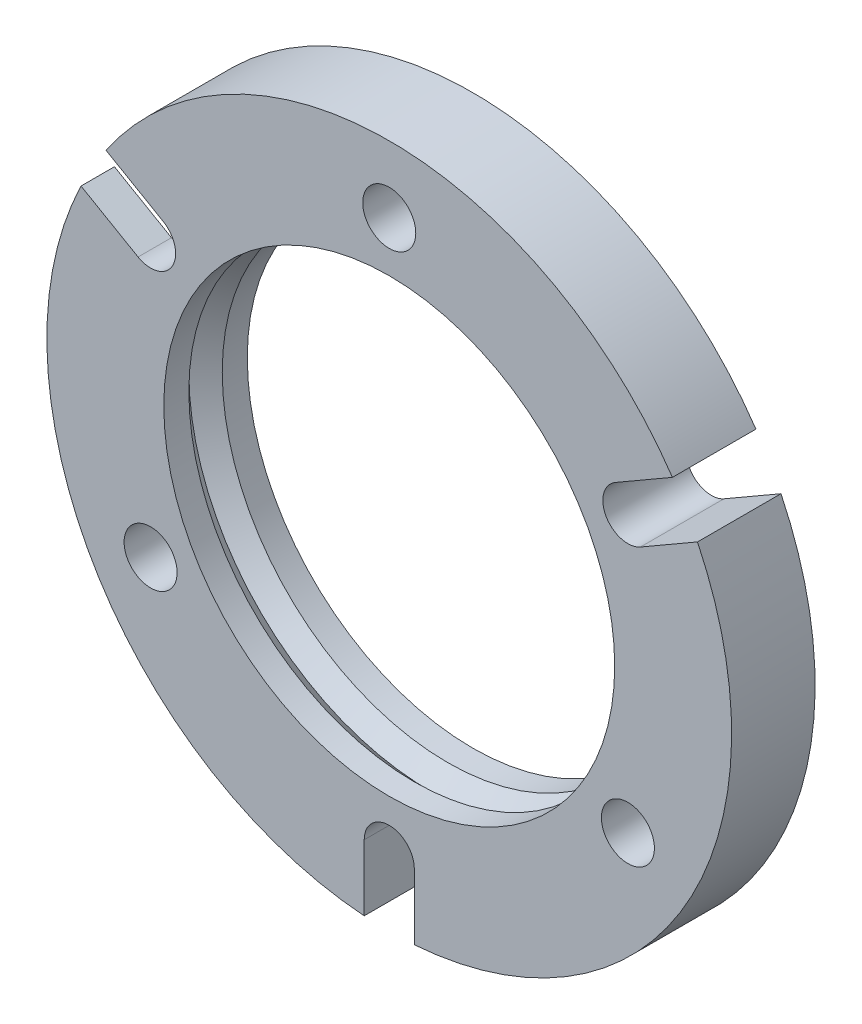
ISO-10303-21;
HEADER;
FILE_DESCRIPTION(('STEP AP214'),'2;1');
FILE_NAME('part.step','',(''),(''),'','','');
FILE_SCHEMA(('AUTOMOTIVE_DESIGN { 1 0 10303 214 1 1 1 1 }'));
ENDSEC;
DATA;
#1=APPLICATION_CONTEXT('core data for automotive mechanical design processes');
#2=APPLICATION_PROTOCOL_DEFINITION('international standard','automotive_design',2000,#1);
#3=PRODUCT_CONTEXT('',#1,'mechanical');
#4=PRODUCT('Part','Part','',(#3));
#5=PRODUCT_RELATED_PRODUCT_CATEGORY('part','',(#4));
#6=PRODUCT_DEFINITION_FORMATION('','',#4);
#7=PRODUCT_DEFINITION_CONTEXT('part definition',#1,'design');
#8=PRODUCT_DEFINITION('design','',#6,#7);
#9=PRODUCT_DEFINITION_SHAPE('','',#8);
#10=(LENGTH_UNIT() NAMED_UNIT(*) SI_UNIT(.MILLI.,.METRE.));
#11=(NAMED_UNIT(*) PLANE_ANGLE_UNIT() SI_UNIT($,.RADIAN.));
#12=(NAMED_UNIT(*) SI_UNIT($,.STERADIAN.) SOLID_ANGLE_UNIT());
#13=UNCERTAINTY_MEASURE_WITH_UNIT(LENGTH_MEASURE(1.E-05),#10,'distance_accuracy_value','');
#14=(GEOMETRIC_REPRESENTATION_CONTEXT(3) GLOBAL_UNCERTAINTY_ASSIGNED_CONTEXT((#13)) GLOBAL_UNIT_ASSIGNED_CONTEXT((#10,
#11,#12)) REPRESENTATION_CONTEXT('',''));
#15=CARTESIAN_POINT('',(0.,0.,0.));
#16=DIRECTION('',(0.,0.,1.));
#17=DIRECTION('',(1.,0.,0.));
#18=AXIS2_PLACEMENT_3D('',#15,#16,#17);
#19=CARTESIAN_POINT('',(0.,0.,0.));
#20=DIRECTION('',(0.,0.,1.));
#21=DIRECTION('',(1.,0.,0.));
#22=AXIS2_PLACEMENT_3D('',#19,#20,#21);
#23=PLANE('',#22);
#24=CARTESIAN_POINT('',(14.2894191624432,-8.25,0.));
#25=DIRECTION('',(0.,0.,1.));
#26=DIRECTION('',(1.,0.,0.));
#27=AXIS2_PLACEMENT_3D('',#24,#25,#26);
#28=CIRCLE('',#27,1.5875);
#29=CARTESIAN_POINT('',(15.8769191624432,-8.25,0.));
#30=VERTEX_POINT('',#29);
#31=EDGE_CURVE('E282',#30,#30,#28,.T.);
#32=ORIENTED_EDGE('',*,*,#31,.T.);
#33=EDGE_LOOP('',(#32));
#34=FACE_BOUND('',#33,.T.);
#35=CARTESIAN_POINT('',(0.,0.,0.));
#36=DIRECTION('',(0.,0.,1.));
#37=DIRECTION('',(1.,0.,0.));
#38=AXIS2_PLACEMENT_3D('',#35,#36,#37);
#39=CIRCLE('',#38,13.5);
#40=CARTESIAN_POINT('',(13.5,0.,0.));
#41=VERTEX_POINT('',#40);
#42=EDGE_CURVE('E294',#41,#41,#39,.T.);
#43=ORIENTED_EDGE('',*,*,#42,.T.);
#44=EDGE_LOOP('',(#43));
#45=FACE_BOUND('',#44,.T.);
#46=CARTESIAN_POINT('',(0.,16.5,0.));
#47=DIRECTION('',(0.,0.,1.));
#48=DIRECTION('',(1.,0.,0.));
#49=AXIS2_PLACEMENT_3D('',#46,#47,#48);
#50=CIRCLE('',#49,1.5875);
#51=CARTESIAN_POINT('',(1.5875,16.5,0.));
#52=VERTEX_POINT('',#51);
#53=EDGE_CURVE('E288',#52,#52,#50,.T.);
#54=ORIENTED_EDGE('',*,*,#53,.T.);
#55=EDGE_LOOP('',(#54));
#56=FACE_BOUND('',#55,.T.);
#57=CARTESIAN_POINT('',(-14.2894191624432,-8.25,0.));
#58=DIRECTION('',(0.,0.,1.));
#59=DIRECTION('',(1.,0.,0.));
#60=AXIS2_PLACEMENT_3D('',#57,#58,#59);
#61=CIRCLE('',#60,1.5875);
#62=CARTESIAN_POINT('',(-12.7019191624432,-8.25,0.));
#63=VERTEX_POINT('',#62);
#64=EDGE_CURVE('E272',#63,#63,#61,.T.);
#65=ORIENTED_EDGE('',*,*,#64,.T.);
#66=EDGE_LOOP('',(#65));
#67=FACE_BOUND('',#66,.T.);
#68=DIRECTION('',(0.382683432365094,0.923879532511285,0.));
#69=VECTOR('',#68,1.);
#70=CARTESIAN_POINT('',(-20.3390922963216,-10.2748918223623,0.));
#71=LINE('',#70,#69);
#72=CARTESIAN_POINT('',(-14.5519568350027,3.69648909564402,0.));
#73=VERTEX_POINT('',#72);
#74=CARTESIAN_POINT('',(-12.9035998636763,7.67597485145243,0.));
#75=VERTEX_POINT('',#74);
#76=EDGE_CURVE('E162',#73,#75,#71,.T.);
#77=ORIENTED_EDGE('',*,*,#76,.T.);
#78=CARTESIAN_POINT('',(-14.2894191624432,8.25000000000007,0.));
#79=DIRECTION('',(0.,0.,1.));
#80=DIRECTION('',(-0.500000000000004,-0.866025403784436,0.));
#81=AXIS2_PLACEMENT_3D('',#78,#79,#80);
#82=CIRCLE('',#81,1.5);
#83=CARTESIAN_POINT('',(-13.5394191624432,9.54903810567672,0.));
#84=VERTEX_POINT('',#83);
#85=EDGE_CURVE('E221',#75,#84,#82,.T.);
#86=ORIENTED_EDGE('',*,*,#85,.T.);
#87=DIRECTION('',(-0.866025403784436,0.500000000000004,0.));
#88=VECTOR('',#87,1.);
#89=CARTESIAN_POINT('',(-38.4302201978172,23.9197487837955,0.));
#90=LINE('',#89,#88);
#91=CARTESIAN_POINT('',(-16.9559312096257,11.5215622558072,0.));
#92=VERTEX_POINT('',#91);
#93=EDGE_CURVE('E223',#84,#92,#90,.T.);
#94=ORIENTED_EDGE('',*,*,#93,.T.);
#95=CARTESIAN_POINT('',(0.,0.,0.));
#96=DIRECTION('',(0.,0.,1.));
#97=DIRECTION('',(1.,0.,0.));
#98=AXIS2_PLACEMENT_3D('',#95,#96,#97);
#99=CIRCLE('',#98,20.5);
#100=CARTESIAN_POINT('',(16.9559312096259,11.5215622558069,0.));
#101=VERTEX_POINT('',#100);
#102=EDGE_CURVE('E386',#101,#92,#99,.T.);
#103=ORIENTED_EDGE('',*,*,#102,.F.);
#104=DIRECTION('',(0.866025403784443,0.499999999999992,0.));
#105=VECTOR('',#104,1.);
#106=CARTESIAN_POINT('',(38.4302201978176,23.919748783795,0.));
#107=LINE('',#106,#105);
#108=CARTESIAN_POINT('',(13.5394191624433,9.54903810567653,0.));
#109=VERTEX_POINT('',#108);
#110=EDGE_CURVE('E198',#109,#101,#107,.T.);
#111=ORIENTED_EDGE('',*,*,#110,.F.);
#112=CARTESIAN_POINT('',(14.2894191624433,8.24999999999987,0.));
#113=DIRECTION('',(0.,0.,1.));
#114=DIRECTION('',(-0.499999999999992,0.866025403784443,0.));
#115=AXIS2_PLACEMENT_3D('',#112,#113,#114);
#116=CIRCLE('',#115,1.5);
#117=CARTESIAN_POINT('',(15.0394191624433,6.9509618943232,0.));
#118=VERTEX_POINT('',#117);
#119=EDGE_CURVE('E200',#109,#118,#116,.T.);
#120=ORIENTED_EDGE('',*,*,#119,.T.);
#121=DIRECTION('',(0.866025403784443,0.499999999999992,0.));
#122=VECTOR('',#121,1.);
#123=CARTESIAN_POINT('',(39.9302201978175,21.3216725724416,0.));
#124=LINE('',#123,#122);
#125=CARTESIAN_POINT('',(18.4559312096259,8.92348604445361,0.));
#126=VERTEX_POINT('',#125);
#127=EDGE_CURVE('E203',#118,#126,#124,.T.);
#128=ORIENTED_EDGE('',*,*,#127,.T.);
#129=CARTESIAN_POINT('',(1.5,-20.4450483002609,0.));
#130=VERTEX_POINT('',#129);
#131=EDGE_CURVE('E46',#130,#126,#99,.T.);
#132=ORIENTED_EDGE('',*,*,#131,.F.);
#133=DIRECTION('',(0.,-1.,0.));
#134=VECTOR('',#133,1.);
#135=CARTESIAN_POINT('',(1.5,-45.2414213562373,0.));
#136=LINE('',#135,#134);
#137=CARTESIAN_POINT('',(1.5,-16.5,0.));
#138=VERTEX_POINT('',#137);
#139=EDGE_CURVE('E253',#138,#130,#136,.T.);
#140=ORIENTED_EDGE('',*,*,#139,.F.);
#141=CARTESIAN_POINT('',(0.,-16.5,0.));
#142=DIRECTION('',(0.,0.,1.));
#143=DIRECTION('',(1.,0.,0.));
#144=AXIS2_PLACEMENT_3D('',#141,#142,#143);
#145=CIRCLE('',#144,1.5);
#146=CARTESIAN_POINT('',(-1.5,-16.5,0.));
#147=VERTEX_POINT('',#146);
#148=EDGE_CURVE('E255',#138,#147,#145,.T.);
#149=ORIENTED_EDGE('',*,*,#148,.T.);
#150=DIRECTION('',(0.,-1.,0.));
#151=VECTOR('',#150,1.);
#152=CARTESIAN_POINT('',(-1.5,-45.2414213562373,0.));
#153=LINE('',#152,#151);
#154=CARTESIAN_POINT('',(-1.5,-20.4450483002609,0.));
#155=VERTEX_POINT('',#154);
#156=EDGE_CURVE('E259',#147,#155,#153,.T.);
#157=ORIENTED_EDGE('',*,*,#156,.T.);
#158=CARTESIAN_POINT('',(-20.1697652153486,3.66477436654886,0.));
#159=VERTEX_POINT('',#158);
#160=EDGE_CURVE('E300',#159,#155,#99,.T.);
#161=ORIENTED_EDGE('',*,*,#160,.F.);
#162=DIRECTION('',(-0.976691955125332,0.214645812429352,0.));
#163=VECTOR('',#162,1.);
#164=CARTESIAN_POINT('',(-43.2949444622215,8.74695289886047,0.));
#165=LINE('',#164,#163);
#166=CARTESIAN_POINT('',(-16.2597448524136,2.80547631150366,0.));
#167=VERTEX_POINT('',#166);
#168=EDGE_CURVE('E175',#167,#159,#165,.T.);
#169=ORIENTED_EDGE('',*,*,#168,.F.);
#170=CARTESIAN_POINT('',(-15.9377761337696,4.27051424419166,0.));
#171=DIRECTION('',(0.,0.,-1.));
#172=DIRECTION('',(-1.,0.,0.));
#173=AXIS2_PLACEMENT_3D('',#170,#171,#172);
#174=CIRCLE('',#173,1.5);
#175=EDGE_CURVE('E188',#73,#167,#174,.T.);
#176=ORIENTED_EDGE('',*,*,#175,.F.);
#177=EDGE_LOOP('',(#77,#86,#94,#103,#111,#120,#128,#132,#140,#149,#157,#161,#169,#176));
#178=FACE_BOUND('',#177,.T.);
#179=ADVANCED_FACE('F42',(#34,#45,#56,#67,#178),#23,.F.);
#180=CARTESIAN_POINT('',(-39.9302201978172,21.3216725724422,0.));
#181=DIRECTION('',(0.500000000000004,0.866025403784436,0.));
#182=DIRECTION('',(-0.866025403784436,0.500000000000004,0.));
#183=AXIS2_PLACEMENT_3D('',#180,#181,#182);
#184=PLANE('',#183);
#185=DIRECTION('',(0.,0.,1.));
#186=VECTOR('',#185,1.);
#187=CARTESIAN_POINT('',(-15.0394191624432,6.95096189432341,0.));
#188=LINE('',#187,#186);
#189=CARTESIAN_POINT('',(-15.0394191624432,6.95096189432341,3.));
#190=VERTEX_POINT('',#189);
#191=CARTESIAN_POINT('',(-15.0394191624432,6.95096189432341,5.));
#192=VERTEX_POINT('',#191);
#193=EDGE_CURVE('E227',#190,#192,#188,.T.);
#194=ORIENTED_EDGE('',*,*,#193,.F.);
#195=DIRECTION('',(0.866025403784436,-0.500000000000004,0.));
#196=VECTOR('',#195,1.);
#197=CARTESIAN_POINT('',(-34.6703034333718,18.2848582125745,3.));
#198=LINE('',#197,#196);
#199=CARTESIAN_POINT('',(-18.4559312096257,8.92348604445386,3.));
#200=VERTEX_POINT('',#199);
#201=EDGE_CURVE('E59',#200,#190,#198,.T.);
#202=ORIENTED_EDGE('',*,*,#201,.F.);
#203=DIRECTION('',(0.,0.,1.));
#204=VECTOR('',#203,1.);
#205=CARTESIAN_POINT('',(-18.4559312096257,8.92348604445386,0.));
#206=LINE('',#205,#204);
#207=CARTESIAN_POINT('',(-18.4559312096257,8.92348604445386,5.));
#208=VERTEX_POINT('',#207);
#209=EDGE_CURVE('E235',#200,#208,#206,.T.);
#210=ORIENTED_EDGE('',*,*,#209,.T.);
#211=DIRECTION('',(-0.866025403784436,0.500000000000004,0.));
#212=VECTOR('',#211,1.);
#213=CARTESIAN_POINT('',(-39.9302201978172,21.3216725724422,5.));
#214=LINE('',#213,#212);
#215=EDGE_CURVE('E215',#192,#208,#214,.T.);
#216=ORIENTED_EDGE('',*,*,#215,.F.);
#217=EDGE_LOOP('',(#194,#202,#210,#216));
#218=FACE_BOUND('',#217,.T.);
#219=ADVANCED_FACE('F335',(#218),#184,.T.);
#220=CARTESIAN_POINT('',(-14.2894191624432,8.25000000000007,0.));
#221=DIRECTION('',(0.,0.,1.));
#222=DIRECTION('',(1.,0.,0.));
#223=AXIS2_PLACEMENT_3D('',#220,#221,#222);
#224=CYLINDRICAL_SURFACE('',#223,1.5);
#225=DIRECTION('',(0.,0.,-1.));
#226=VECTOR('',#225,1.);
#227=CARTESIAN_POINT('',(-12.9035998636763,7.67597485145243,3.));
#228=LINE('',#227,#226);
#229=CARTESIAN_POINT('',(-12.9035998636763,7.67597485145243,3.));
#230=VERTEX_POINT('',#229);
#231=EDGE_CURVE('E191',#230,#75,#228,.T.);
#232=ORIENTED_EDGE('',*,*,#231,.F.);
#233=CARTESIAN_POINT('',(-14.2894191624432,8.25000000000007,3.));
#234=DIRECTION('',(0.,0.,-1.));
#235=DIRECTION('',(-1.,0.,0.));
#236=AXIS2_PLACEMENT_3D('',#233,#234,#235);
#237=CIRCLE('',#236,1.5);
#238=EDGE_CURVE('E168',#190,#230,#237,.F.);
#239=ORIENTED_EDGE('',*,*,#238,.F.);
#240=ORIENTED_EDGE('',*,*,#193,.T.);
#241=CARTESIAN_POINT('',(-14.2894191624432,8.25000000000007,5.));
#242=DIRECTION('',(0.,0.,1.));
#243=DIRECTION('',(-0.500000000000004,-0.866025403784436,0.));
#244=AXIS2_PLACEMENT_3D('',#241,#242,#243);
#245=CIRCLE('',#244,1.5);
#246=CARTESIAN_POINT('',(-13.5394191624432,9.54903810567672,5.));
#247=VERTEX_POINT('',#246);
#248=EDGE_CURVE('E230',#192,#247,#245,.T.);
#249=ORIENTED_EDGE('',*,*,#248,.T.);
#250=DIRECTION('',(0.,0.,1.));
#251=VECTOR('',#250,1.);
#252=CARTESIAN_POINT('',(-13.5394191624432,9.54903810567672,0.));
#253=LINE('',#252,#251);
#254=EDGE_CURVE('E241',#84,#247,#253,.T.);
#255=ORIENTED_EDGE('',*,*,#254,.F.);
#256=ORIENTED_EDGE('',*,*,#85,.F.);
#257=EDGE_LOOP('',(#232,#239,#240,#249,#255,#256));
#258=FACE_BOUND('',#257,.T.);
#259=ADVANCED_FACE('F340',(#258),#224,.F.);
#260=CARTESIAN_POINT('',(0.,0.,5.));
#261=DIRECTION('',(0.,0.,1.));
#262=DIRECTION('',(1.,0.,0.));
#263=AXIS2_PLACEMENT_3D('',#260,#261,#262);
#264=PLANE('',#263);
#265=CARTESIAN_POINT('',(-14.2894191624432,-8.25,5.));
#266=DIRECTION('',(0.,0.,1.));
#267=DIRECTION('',(1.,0.,0.));
#268=AXIS2_PLACEMENT_3D('',#265,#266,#267);
#269=CIRCLE('',#268,1.5875);
#270=CARTESIAN_POINT('',(-12.7019191624432,-8.25,5.));
#271=VERTEX_POINT('',#270);
#272=EDGE_CURVE('E279',#271,#271,#269,.T.);
#273=ORIENTED_EDGE('',*,*,#272,.F.);
#274=EDGE_LOOP('',(#273));
#275=FACE_BOUND('',#274,.T.);
#276=CARTESIAN_POINT('',(0.,16.5,5.));
#277=DIRECTION('',(0.,0.,1.));
#278=DIRECTION('',(1.,0.,0.));
#279=AXIS2_PLACEMENT_3D('',#276,#277,#278);
#280=CIRCLE('',#279,1.5875);
#281=CARTESIAN_POINT('',(1.5875,16.5,5.));
#282=VERTEX_POINT('',#281);
#283=EDGE_CURVE('E291',#282,#282,#280,.T.);
#284=ORIENTED_EDGE('',*,*,#283,.F.);
#285=EDGE_LOOP('',(#284));
#286=FACE_BOUND('',#285,.T.);
#287=CARTESIAN_POINT('',(0.,0.,5.));
#288=DIRECTION('',(0.,0.,1.));
#289=DIRECTION('',(1.,0.,0.));
#290=AXIS2_PLACEMENT_3D('',#287,#288,#289);
#291=CIRCLE('',#290,13.5);
#292=CARTESIAN_POINT('',(13.5,0.,5.));
#293=VERTEX_POINT('',#292);
#294=EDGE_CURVE('E297',#293,#293,#291,.T.);
#295=ORIENTED_EDGE('',*,*,#294,.F.);
#296=EDGE_LOOP('',(#295));
#297=FACE_BOUND('',#296,.T.);
#298=CARTESIAN_POINT('',(14.2894191624432,-8.25,5.));
#299=DIRECTION('',(0.,0.,1.));
#300=DIRECTION('',(1.,0.,0.));
#301=AXIS2_PLACEMENT_3D('',#298,#299,#300);
#302=CIRCLE('',#301,1.5875);
#303=CARTESIAN_POINT('',(15.8769191624432,-8.25,5.));
#304=VERTEX_POINT('',#303);
#305=EDGE_CURVE('E285',#304,#304,#302,.T.);
#306=ORIENTED_EDGE('',*,*,#305,.F.);
#307=EDGE_LOOP('',(#306));
#308=FACE_BOUND('',#307,.T.);
#309=CARTESIAN_POINT('',(14.2894191624433,8.24999999999987,5.));
#310=DIRECTION('',(0.,0.,1.));
#311=DIRECTION('',(-0.499999999999992,0.866025403784443,0.));
#312=AXIS2_PLACEMENT_3D('',#309,#310,#311);
#313=CIRCLE('',#312,1.5);
#314=CARTESIAN_POINT('',(13.5394191624433,9.54903810567653,5.));
#315=VERTEX_POINT('',#314);
#316=CARTESIAN_POINT('',(15.0394191624433,6.9509618943232,5.));
#317=VERTEX_POINT('',#316);
#318=EDGE_CURVE('E209',#315,#317,#313,.T.);
#319=ORIENTED_EDGE('',*,*,#318,.F.);
#320=DIRECTION('',(0.866025403784443,0.499999999999992,0.));
#321=VECTOR('',#320,1.);
#322=CARTESIAN_POINT('',(38.4302201978176,23.919748783795,5.));
#323=LINE('',#322,#321);
#324=CARTESIAN_POINT('',(16.9559312096259,11.5215622558069,5.));
#325=VERTEX_POINT('',#324);
#326=EDGE_CURVE('E193',#315,#325,#323,.T.);
#327=ORIENTED_EDGE('',*,*,#326,.T.);
#328=CARTESIAN_POINT('',(0.,0.,5.));
#329=DIRECTION('',(0.,0.,1.));
#330=DIRECTION('',(1.,0.,0.));
#331=AXIS2_PLACEMENT_3D('',#328,#329,#330);
#332=CIRCLE('',#331,20.5);
#333=CARTESIAN_POINT('',(-16.9559312096257,11.5215622558072,5.));
#334=VERTEX_POINT('',#333);
#335=EDGE_CURVE('E51',#325,#334,#332,.T.);
#336=ORIENTED_EDGE('',*,*,#335,.T.);
#337=DIRECTION('',(-0.866025403784436,0.500000000000004,0.));
#338=VECTOR('',#337,1.);
#339=CARTESIAN_POINT('',(-38.4302201978172,23.9197487837955,5.));
#340=LINE('',#339,#338);
#341=EDGE_CURVE('E224',#247,#334,#340,.T.);
#342=ORIENTED_EDGE('',*,*,#341,.F.);
#343=ORIENTED_EDGE('',*,*,#248,.F.);
#344=ORIENTED_EDGE('',*,*,#215,.T.);
#345=CARTESIAN_POINT('',(-1.5,-20.4450483002609,5.));
#346=VERTEX_POINT('',#345);
#347=EDGE_CURVE('E52',#208,#346,#332,.T.);
#348=ORIENTED_EDGE('',*,*,#347,.T.);
#349=DIRECTION('',(0.,-1.,0.));
#350=VECTOR('',#349,1.);
#351=CARTESIAN_POINT('',(-1.5,-45.2414213562373,5.));
#352=LINE('',#351,#350);
#353=CARTESIAN_POINT('',(-1.5,-16.5,5.));
#354=VERTEX_POINT('',#353);
#355=EDGE_CURVE('E256',#354,#346,#352,.T.);
#356=ORIENTED_EDGE('',*,*,#355,.F.);
#357=CARTESIAN_POINT('',(0.,-16.5,5.));
#358=DIRECTION('',(0.,0.,1.));
#359=DIRECTION('',(1.,0.,0.));
#360=AXIS2_PLACEMENT_3D('',#357,#358,#359);
#361=CIRCLE('',#360,1.5);
#362=CARTESIAN_POINT('',(1.5,-16.5,5.));
#363=VERTEX_POINT('',#362);
#364=EDGE_CURVE('E265',#363,#354,#361,.T.);
#365=ORIENTED_EDGE('',*,*,#364,.F.);
#366=DIRECTION('',(0.,-1.,0.));
#367=VECTOR('',#366,1.);
#368=CARTESIAN_POINT('',(1.5,-45.2414213562373,5.));
#369=LINE('',#368,#367);
#370=CARTESIAN_POINT('',(1.5,-20.4450483002609,5.));
#371=VERTEX_POINT('',#370);
#372=EDGE_CURVE('E252',#363,#371,#369,.T.);
#373=ORIENTED_EDGE('',*,*,#372,.T.);
#374=CARTESIAN_POINT('',(18.4559312096259,8.92348604445361,5.));
#375=VERTEX_POINT('',#374);
#376=EDGE_CURVE('E11',#371,#375,#332,.T.);
#377=ORIENTED_EDGE('',*,*,#376,.T.);
#378=DIRECTION('',(0.866025403784443,0.499999999999992,0.));
#379=VECTOR('',#378,1.);
#380=CARTESIAN_POINT('',(39.9302201978175,21.3216725724416,5.));
#381=LINE('',#380,#379);
#382=EDGE_CURVE('E67',#317,#375,#381,.T.);
#383=ORIENTED_EDGE('',*,*,#382,.F.);
#384=EDGE_LOOP('',(#319,#327,#336,#342,#343,#344,#348,#356,#365,#373,#377,#383));
#385=FACE_BOUND('',#384,.T.);
#386=ADVANCED_FACE('F343',(#275,#286,#297,#308,#385),#264,.T.);
#387=CARTESIAN_POINT('',(0.,0.,5.));
#388=DIRECTION('',(0.,0.,-1.));
#389=DIRECTION('',(-1.,0.,0.));
#390=AXIS2_PLACEMENT_3D('',#387,#388,#389);
#391=CYLINDRICAL_SURFACE('',#390,20.5);
#392=DIRECTION('',(0.,0.,1.));
#393=VECTOR('',#392,1.);
#394=CARTESIAN_POINT('',(16.9559312096259,11.5215622558069,0.));
#395=LINE('',#394,#393);
#396=EDGE_CURVE('E213',#101,#325,#395,.T.);
#397=ORIENTED_EDGE('',*,*,#396,.F.);
#398=ORIENTED_EDGE('',*,*,#102,.T.);
#399=DIRECTION('',(0.,0.,1.));
#400=VECTOR('',#399,1.);
#401=CARTESIAN_POINT('',(-16.9559312096257,11.5215622558072,0.));
#402=LINE('',#401,#400);
#403=EDGE_CURVE('E238',#92,#334,#402,.T.);
#404=ORIENTED_EDGE('',*,*,#403,.T.);
#405=ORIENTED_EDGE('',*,*,#335,.F.);
#406=EDGE_LOOP('',(#397,#398,#404,#405));
#407=FACE_BOUND('',#406,.T.);
#408=ADVANCED_FACE('F345',(#407),#391,.T.);
#409=CARTESIAN_POINT('',(0.,0.,3.));
#410=DIRECTION('',(0.,0.,-1.));
#411=DIRECTION('',(-1.,0.,0.));
#412=AXIS2_PLACEMENT_3D('',#409,#410,#411);
#413=CIRCLE('',#412,20.5);
#414=CARTESIAN_POINT('',(-20.1697652153486,3.66477436654886,3.));
#415=VERTEX_POINT('',#414);
#416=EDGE_CURVE('E181',#415,#200,#413,.T.);
#417=ORIENTED_EDGE('',*,*,#416,.F.);
#418=DIRECTION('',(0.,0.,-1.));
#419=VECTOR('',#418,1.);
#420=CARTESIAN_POINT('',(-20.1697652153486,3.66477436654886,3.));
#421=LINE('',#420,#419);
#422=EDGE_CURVE('E194',#415,#159,#421,.T.);
#423=ORIENTED_EDGE('',*,*,#422,.T.);
#424=ORIENTED_EDGE('',*,*,#160,.T.);
#425=DIRECTION('',(0.,0.,1.));
#426=VECTOR('',#425,1.);
#427=CARTESIAN_POINT('',(-1.5,-20.4450483002609,0.));
#428=LINE('',#427,#426);
#429=EDGE_CURVE('E273',#155,#346,#428,.T.);
#430=ORIENTED_EDGE('',*,*,#429,.T.);
#431=ORIENTED_EDGE('',*,*,#347,.F.);
#432=ORIENTED_EDGE('',*,*,#209,.F.);
#433=EDGE_LOOP('',(#417,#423,#424,#430,#431,#432));
#434=FACE_BOUND('',#433,.T.);
#435=ADVANCED_FACE('F309',(#434),#391,.T.);
#436=CARTESIAN_POINT('',(0.,0.,5.));
#437=DIRECTION('',(0.,0.,-1.));
#438=DIRECTION('',(-1.,0.,0.));
#439=AXIS2_PLACEMENT_3D('',#436,#437,#438);
#440=CYLINDRICAL_SURFACE('',#439,13.5);
#441=ORIENTED_EDGE('',*,*,#42,.F.);
#442=EDGE_LOOP('',(#441));
#443=FACE_BOUND('',#442,.T.);
#444=CARTESIAN_POINT('',(0.,0.,1.50000000000002));
#445=DIRECTION('',(0.,0.,-1.));
#446=DIRECTION('',(-1.,0.,0.));
#447=AXIS2_PLACEMENT_3D('',#444,#445,#446);
#448=CIRCLE('',#447,13.5);
#449=CARTESIAN_POINT('',(-13.5,0.,1.50000000000002));
#450=VERTEX_POINT('',#449);
#451=EDGE_CURVE('E237',#450,#450,#448,.T.);
#452=ORIENTED_EDGE('',*,*,#451,.F.);
#453=EDGE_LOOP('',(#452));
#454=FACE_BOUND('',#453,.T.);
#455=ADVANCED_FACE('F306',(#443,#454),#440,.F.);
#456=ORIENTED_EDGE('',*,*,#131,.T.);
#457=DIRECTION('',(0.,0.,1.));
#458=VECTOR('',#457,1.);
#459=CARTESIAN_POINT('',(18.4559312096259,8.92348604445361,0.));
#460=LINE('',#459,#458);
#461=EDGE_CURVE('E216',#126,#375,#460,.T.);
#462=ORIENTED_EDGE('',*,*,#461,.T.);
#463=ORIENTED_EDGE('',*,*,#376,.F.);
#464=DIRECTION('',(0.,0.,1.));
#465=VECTOR('',#464,1.);
#466=CARTESIAN_POINT('',(1.5,-20.4450483002609,0.));
#467=LINE('',#466,#465);
#468=EDGE_CURVE('E270',#130,#371,#467,.T.);
#469=ORIENTED_EDGE('',*,*,#468,.F.);
#470=EDGE_LOOP('',(#456,#462,#463,#469));
#471=FACE_BOUND('',#470,.T.);
#472=ADVANCED_FACE('F44',(#471),#391,.T.);
#473=CARTESIAN_POINT('',(0.,0.,3.49999999999999));
#474=DIRECTION('',(0.,0.,-1.));
#475=DIRECTION('',(-1.,0.,0.));
#476=AXIS2_PLACEMENT_3D('',#473,#474,#475);
#477=CIRCLE('',#476,13.5);
#478=CARTESIAN_POINT('',(-13.5,0.,3.49999999999999));
#479=VERTEX_POINT('',#478);
#480=EDGE_CURVE('E246',#479,#479,#477,.T.);
#481=ORIENTED_EDGE('',*,*,#480,.T.);
#482=EDGE_LOOP('',(#481));
#483=FACE_BOUND('',#482,.T.);
#484=ORIENTED_EDGE('',*,*,#294,.T.);
#485=EDGE_LOOP('',(#484));
#486=FACE_BOUND('',#485,.T.);
#487=ADVANCED_FACE('F311',(#483,#486),#440,.F.);
#488=CARTESIAN_POINT('',(0.,16.5,5.));
#489=DIRECTION('',(0.,0.,-1.));
#490=DIRECTION('',(-1.,0.,0.));
#491=AXIS2_PLACEMENT_3D('',#488,#489,#490);
#492=CYLINDRICAL_SURFACE('',#491,1.5875);
#493=ORIENTED_EDGE('',*,*,#283,.T.);
#494=EDGE_LOOP('',(#493));
#495=FACE_BOUND('',#494,.T.);
#496=ORIENTED_EDGE('',*,*,#53,.F.);
#497=EDGE_LOOP('',(#496));
#498=FACE_BOUND('',#497,.T.);
#499=ADVANCED_FACE('F349',(#495,#498),#492,.F.);
#500=CARTESIAN_POINT('',(14.2894191624432,-8.25,5.));
#501=DIRECTION('',(0.,0.,-1.));
#502=DIRECTION('',(-1.,0.,0.));
#503=AXIS2_PLACEMENT_3D('',#500,#501,#502);
#504=CYLINDRICAL_SURFACE('',#503,1.5875);
#505=ORIENTED_EDGE('',*,*,#305,.T.);
#506=EDGE_LOOP('',(#505));
#507=FACE_BOUND('',#506,.T.);
#508=ORIENTED_EDGE('',*,*,#31,.F.);
#509=EDGE_LOOP('',(#508));
#510=FACE_BOUND('',#509,.T.);
#511=ADVANCED_FACE('F353',(#507,#510),#504,.F.);
#512=CARTESIAN_POINT('',(-14.2894191624432,-8.25,5.));
#513=DIRECTION('',(0.,0.,-1.));
#514=DIRECTION('',(-1.,0.,0.));
#515=AXIS2_PLACEMENT_3D('',#512,#513,#514);
#516=CYLINDRICAL_SURFACE('',#515,1.5875);
#517=ORIENTED_EDGE('',*,*,#272,.T.);
#518=EDGE_LOOP('',(#517));
#519=FACE_BOUND('',#518,.T.);
#520=ORIENTED_EDGE('',*,*,#64,.F.);
#521=EDGE_LOOP('',(#520));
#522=FACE_BOUND('',#521,.T.);
#523=ADVANCED_FACE('F357',(#519,#522),#516,.F.);
#524=CARTESIAN_POINT('',(1.5,-45.2414213562373,0.));
#525=DIRECTION('',(-1.,0.,0.));
#526=DIRECTION('',(0.,0.,1.));
#527=AXIS2_PLACEMENT_3D('',#524,#525,#526);
#528=PLANE('',#527);
#529=ORIENTED_EDGE('',*,*,#372,.F.);
#530=DIRECTION('',(0.,0.,1.));
#531=VECTOR('',#530,1.);
#532=CARTESIAN_POINT('',(1.5,-16.5,0.));
#533=LINE('',#532,#531);
#534=EDGE_CURVE('E262',#138,#363,#533,.T.);
#535=ORIENTED_EDGE('',*,*,#534,.F.);
#536=ORIENTED_EDGE('',*,*,#139,.T.);
#537=ORIENTED_EDGE('',*,*,#468,.T.);
#538=EDGE_LOOP('',(#529,#535,#536,#537));
#539=FACE_BOUND('',#538,.T.);
#540=ADVANCED_FACE('F361',(#539),#528,.T.);
#541=CARTESIAN_POINT('',(-1.5,-45.2414213562373,0.));
#542=DIRECTION('',(-1.,0.,0.));
#543=DIRECTION('',(0.,0.,1.));
#544=AXIS2_PLACEMENT_3D('',#541,#542,#543);
#545=PLANE('',#544);
#546=ORIENTED_EDGE('',*,*,#355,.T.);
#547=ORIENTED_EDGE('',*,*,#429,.F.);
#548=ORIENTED_EDGE('',*,*,#156,.F.);
#549=DIRECTION('',(0.,0.,1.));
#550=VECTOR('',#549,1.);
#551=CARTESIAN_POINT('',(-1.5,-16.5,0.));
#552=LINE('',#551,#550);
#553=EDGE_CURVE('E276',#147,#354,#552,.T.);
#554=ORIENTED_EDGE('',*,*,#553,.T.);
#555=EDGE_LOOP('',(#546,#547,#548,#554));
#556=FACE_BOUND('',#555,.T.);
#557=ADVANCED_FACE('F365',(#556),#545,.F.);
#558=CARTESIAN_POINT('',(0.,-16.5,0.));
#559=DIRECTION('',(0.,0.,1.));
#560=DIRECTION('',(1.,0.,0.));
#561=AXIS2_PLACEMENT_3D('',#558,#559,#560);
#562=CYLINDRICAL_SURFACE('',#561,1.5);
#563=ORIENTED_EDGE('',*,*,#364,.T.);
#564=ORIENTED_EDGE('',*,*,#553,.F.);
#565=ORIENTED_EDGE('',*,*,#148,.F.);
#566=ORIENTED_EDGE('',*,*,#534,.T.);
#567=EDGE_LOOP('',(#563,#564,#565,#566));
#568=FACE_BOUND('',#567,.T.);
#569=ADVANCED_FACE('F318',(#568),#562,.F.);
#570=CARTESIAN_POINT('',(0.,0.,2.5));
#571=DIRECTION('',(0.,0.,1.));
#572=DIRECTION('',(1.,0.,0.));
#573=AXIS2_PLACEMENT_3D('',#570,#571,#572);
#574=CONICAL_SURFACE('',#573,14.5,0.785398163397456);
#575=ORIENTED_EDGE('',*,*,#451,.T.);
#576=EDGE_LOOP('',(#575));
#577=FACE_BOUND('',#576,.T.);
#578=CARTESIAN_POINT('',(0.,0.,2.5));
#579=DIRECTION('',(0.,0.,-1.));
#580=DIRECTION('',(-1.,0.,0.));
#581=AXIS2_PLACEMENT_3D('',#578,#579,#580);
#582=CIRCLE('',#581,14.5);
#583=CARTESIAN_POINT('',(-14.5,0.,2.5));
#584=VERTEX_POINT('',#583);
#585=EDGE_CURVE('E249',#584,#584,#582,.T.);
#586=ORIENTED_EDGE('',*,*,#585,.F.);
#587=EDGE_LOOP('',(#586));
#588=FACE_BOUND('',#587,.T.);
#589=ADVANCED_FACE('F314',(#577,#588),#574,.F.);
#590=CARTESIAN_POINT('',(0.,0.,2.5));
#591=DIRECTION('',(0.,0.,-1.));
#592=DIRECTION('',(-1.,0.,0.));
#593=AXIS2_PLACEMENT_3D('',#590,#591,#592);
#594=CONICAL_SURFACE('',#593,14.5,0.785398163397454);
#595=ORIENTED_EDGE('',*,*,#480,.F.);
#596=EDGE_LOOP('',(#595));
#597=FACE_BOUND('',#596,.T.);
#598=ORIENTED_EDGE('',*,*,#585,.T.);
#599=EDGE_LOOP('',(#598));
#600=FACE_BOUND('',#599,.T.);
#601=ADVANCED_FACE('F317',(#597,#600),#594,.F.);
#602=CARTESIAN_POINT('',(-38.4302201978172,23.9197487837955,0.));
#603=DIRECTION('',(0.500000000000004,0.866025403784436,0.));
#604=DIRECTION('',(-0.866025403784436,0.500000000000004,0.));
#605=AXIS2_PLACEMENT_3D('',#602,#603,#604);
#606=PLANE('',#605);
#607=ORIENTED_EDGE('',*,*,#341,.T.);
#608=ORIENTED_EDGE('',*,*,#403,.F.);
#609=ORIENTED_EDGE('',*,*,#93,.F.);
#610=ORIENTED_EDGE('',*,*,#254,.T.);
#611=EDGE_LOOP('',(#607,#608,#609,#610));
#612=FACE_BOUND('',#611,.T.);
#613=ADVANCED_FACE('F323',(#612),#606,.F.);
#614=CARTESIAN_POINT('',(38.4302201978176,23.919748783795,0.));
#615=DIRECTION('',(0.499999999999992,-0.866025403784443,0.));
#616=DIRECTION('',(0.866025403784443,0.499999999999992,0.));
#617=AXIS2_PLACEMENT_3D('',#614,#615,#616);
#618=PLANE('',#617);
#619=ORIENTED_EDGE('',*,*,#326,.F.);
#620=DIRECTION('',(0.,0.,1.));
#621=VECTOR('',#620,1.);
#622=CARTESIAN_POINT('',(13.5394191624433,9.54903810567653,0.));
#623=LINE('',#622,#621);
#624=EDGE_CURVE('E206',#109,#315,#623,.T.);
#625=ORIENTED_EDGE('',*,*,#624,.F.);
#626=ORIENTED_EDGE('',*,*,#110,.T.);
#627=ORIENTED_EDGE('',*,*,#396,.T.);
#628=EDGE_LOOP('',(#619,#625,#626,#627));
#629=FACE_BOUND('',#628,.T.);
#630=ADVANCED_FACE('F329',(#629),#618,.T.);
#631=CARTESIAN_POINT('',(39.9302201978175,21.3216725724416,0.));
#632=DIRECTION('',(0.499999999999992,-0.866025403784443,0.));
#633=DIRECTION('',(0.866025403784443,0.499999999999992,0.));
#634=AXIS2_PLACEMENT_3D('',#631,#632,#633);
#635=PLANE('',#634);
#636=ORIENTED_EDGE('',*,*,#382,.T.);
#637=ORIENTED_EDGE('',*,*,#461,.F.);
#638=ORIENTED_EDGE('',*,*,#127,.F.);
#639=DIRECTION('',(0.,0.,1.));
#640=VECTOR('',#639,1.);
#641=CARTESIAN_POINT('',(15.0394191624433,6.9509618943232,0.));
#642=LINE('',#641,#640);
#643=EDGE_CURVE('E218',#118,#317,#642,.T.);
#644=ORIENTED_EDGE('',*,*,#643,.T.);
#645=EDGE_LOOP('',(#636,#637,#638,#644));
#646=FACE_BOUND('',#645,.T.);
#647=ADVANCED_FACE('F420',(#646),#635,.F.);
#648=CARTESIAN_POINT('',(14.2894191624433,8.24999999999987,0.));
#649=DIRECTION('',(0.,0.,1.));
#650=DIRECTION('',(1.,0.,0.));
#651=AXIS2_PLACEMENT_3D('',#648,#649,#650);
#652=CYLINDRICAL_SURFACE('',#651,1.5);
#653=ORIENTED_EDGE('',*,*,#318,.T.);
#654=ORIENTED_EDGE('',*,*,#643,.F.);
#655=ORIENTED_EDGE('',*,*,#119,.F.);
#656=ORIENTED_EDGE('',*,*,#624,.T.);
#657=EDGE_LOOP('',(#653,#654,#655,#656));
#658=FACE_BOUND('',#657,.T.);
#659=ADVANCED_FACE('F416',(#658),#652,.F.);
#660=CARTESIAN_POINT('',(-20.3390922963216,-10.2748918223623,3.));
#661=DIRECTION('',(-0.923879532511285,0.382683432365093,0.));
#662=DIRECTION('',(-0.382683432365094,-0.923879532511285,0.));
#663=AXIS2_PLACEMENT_3D('',#660,#661,#662);
#664=PLANE('',#663);
#665=ORIENTED_EDGE('',*,*,#76,.F.);
#666=DIRECTION('',(0.,0.,-1.));
#667=VECTOR('',#666,1.);
#668=CARTESIAN_POINT('',(-14.5519568350027,3.69648909564402,3.));
#669=LINE('',#668,#667);
#670=CARTESIAN_POINT('',(-14.5519568350027,3.69648909564402,3.));
#671=VERTEX_POINT('',#670);
#672=EDGE_CURVE('E157',#671,#73,#669,.T.);
#673=ORIENTED_EDGE('',*,*,#672,.F.);
#674=DIRECTION('',(0.382683432365094,0.923879532511285,0.));
#675=VECTOR('',#674,1.);
#676=CARTESIAN_POINT('',(-20.3390922963216,-10.2748918223623,3.));
#677=LINE('',#676,#675);
#678=EDGE_CURVE('E160',#671,#230,#677,.T.);
#679=ORIENTED_EDGE('',*,*,#678,.T.);
#680=ORIENTED_EDGE('',*,*,#231,.T.);
#681=EDGE_LOOP('',(#665,#673,#679,#680));
#682=FACE_BOUND('',#681,.T.);
#683=ADVANCED_FACE('F159',(#682),#664,.T.);
#684=CARTESIAN_POINT('',(-43.2949444622215,8.74695289886047,3.));
#685=DIRECTION('',(-0.214645812429352,-0.976691955125332,0.));
#686=DIRECTION('',(0.976691955125332,-0.214645812429352,0.));
#687=AXIS2_PLACEMENT_3D('',#684,#685,#686);
#688=PLANE('',#687);
#689=ORIENTED_EDGE('',*,*,#168,.T.);
#690=ORIENTED_EDGE('',*,*,#422,.F.);
#691=DIRECTION('',(-0.976691955125332,0.214645812429352,0.));
#692=VECTOR('',#691,1.);
#693=CARTESIAN_POINT('',(-43.2949444622215,8.74695289886047,3.));
#694=LINE('',#693,#692);
#695=CARTESIAN_POINT('',(-16.2597448524136,2.80547631150366,3.));
#696=VERTEX_POINT('',#695);
#697=EDGE_CURVE('E179',#696,#415,#694,.T.);
#698=ORIENTED_EDGE('',*,*,#697,.F.);
#699=DIRECTION('',(0.,0.,-1.));
#700=VECTOR('',#699,1.);
#701=CARTESIAN_POINT('',(-16.2597448524136,2.80547631150366,3.));
#702=LINE('',#701,#700);
#703=EDGE_CURVE('E167',#696,#167,#702,.T.);
#704=ORIENTED_EDGE('',*,*,#703,.T.);
#705=EDGE_LOOP('',(#689,#690,#698,#704));
#706=FACE_BOUND('',#705,.T.);
#707=ADVANCED_FACE('F408',(#706),#688,.F.);
#708=CARTESIAN_POINT('',(-15.9377761337696,4.27051424419166,3.));
#709=DIRECTION('',(0.,0.,-1.));
#710=DIRECTION('',(-1.,0.,0.));
#711=AXIS2_PLACEMENT_3D('',#708,#709,#710);
#712=CYLINDRICAL_SURFACE('',#711,1.5);
#713=ORIENTED_EDGE('',*,*,#175,.T.);
#714=ORIENTED_EDGE('',*,*,#703,.F.);
#715=CARTESIAN_POINT('',(-15.9377761337696,4.27051424419166,3.));
#716=DIRECTION('',(0.,0.,-1.));
#717=DIRECTION('',(-1.,0.,0.));
#718=AXIS2_PLACEMENT_3D('',#715,#716,#717);
#719=CIRCLE('',#718,1.5);
#720=EDGE_CURVE('E173',#671,#696,#719,.T.);
#721=ORIENTED_EDGE('',*,*,#720,.F.);
#722=ORIENTED_EDGE('',*,*,#672,.T.);
#723=EDGE_LOOP('',(#713,#714,#721,#722));
#724=FACE_BOUND('',#723,.T.);
#725=ADVANCED_FACE('F177',(#724),#712,.F.);
#726=CARTESIAN_POINT('',(-45.2112080551775,0.0274758498695688,3.));
#727=DIRECTION('',(0.,0.,-1.));
#728=DIRECTION('',(-1.,0.,0.));
#729=AXIS2_PLACEMENT_3D('',#726,#727,#728);
#730=PLANE('',#729);
#731=ORIENTED_EDGE('',*,*,#678,.F.);
#732=ORIENTED_EDGE('',*,*,#720,.T.);
#733=ORIENTED_EDGE('',*,*,#697,.T.);
#734=ORIENTED_EDGE('',*,*,#416,.T.);
#735=ORIENTED_EDGE('',*,*,#201,.T.);
#736=ORIENTED_EDGE('',*,*,#238,.T.);
#737=EDGE_LOOP('',(#731,#732,#733,#734,#735,#736));
#738=FACE_BOUND('',#737,.T.);
#739=ADVANCED_FACE('F171',(#738),#730,.T.);
#740=CLOSED_SHELL('',(#179,#219,#259,#386,#408,#435,#455,#472,#487,#499,#511,#523,#540,#557,
#569,#589,#601,#613,#630,#647,#659,#683,#707,#725,#739));
#741=MANIFOLD_SOLID_BREP('B2',#740);
#742=ADVANCED_BREP_SHAPE_REPRESENTATION('',(#18,#741),#14);
#743=SHAPE_DEFINITION_REPRESENTATION(#9,#742);
ENDSEC;
END-ISO-10303-21;
